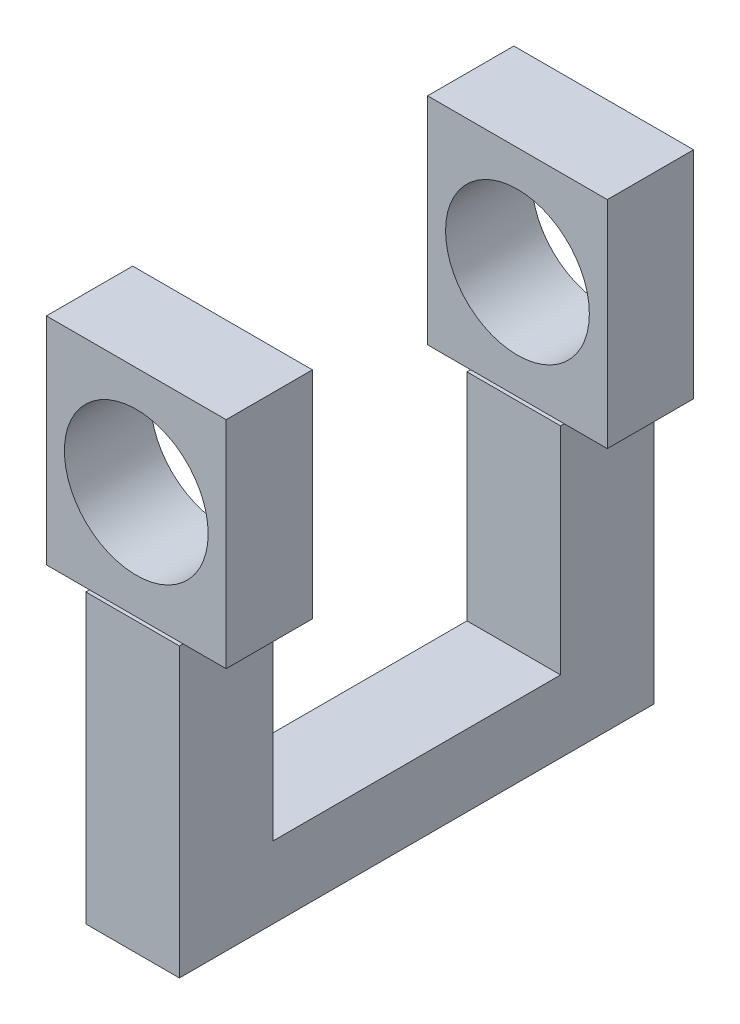
ISO-10303-21;
HEADER;
FILE_DESCRIPTION(('STEP AP214'),'2;1');
FILE_NAME('part.step','',(''),(''),'','','');
FILE_SCHEMA(('AUTOMOTIVE_DESIGN { 1 0 10303 214 1 1 1 1 }'));
ENDSEC;
DATA;
#1=APPLICATION_CONTEXT('core data for automotive mechanical design processes');
#2=APPLICATION_PROTOCOL_DEFINITION('international standard','automotive_design',2000,#1);
#3=PRODUCT_CONTEXT('',#1,'mechanical');
#4=PRODUCT('Part','Part','',(#3));
#5=PRODUCT_RELATED_PRODUCT_CATEGORY('part','',(#4));
#6=PRODUCT_DEFINITION_FORMATION('','',#4);
#7=PRODUCT_DEFINITION_CONTEXT('part definition',#1,'design');
#8=PRODUCT_DEFINITION('design','',#6,#7);
#9=PRODUCT_DEFINITION_SHAPE('','',#8);
#10=(LENGTH_UNIT() NAMED_UNIT(*) SI_UNIT(.MILLI.,.METRE.));
#11=(NAMED_UNIT(*) PLANE_ANGLE_UNIT() SI_UNIT($,.RADIAN.));
#12=(NAMED_UNIT(*) SI_UNIT($,.STERADIAN.) SOLID_ANGLE_UNIT());
#13=UNCERTAINTY_MEASURE_WITH_UNIT(LENGTH_MEASURE(1.E-05),#10,'distance_accuracy_value','');
#14=(GEOMETRIC_REPRESENTATION_CONTEXT(3) GLOBAL_UNCERTAINTY_ASSIGNED_CONTEXT((#13)) GLOBAL_UNIT_ASSIGNED_CONTEXT((#10,
#11,#12)) REPRESENTATION_CONTEXT('',''));
#15=CARTESIAN_POINT('',(0.,0.,0.));
#16=DIRECTION('',(0.,0.,1.));
#17=DIRECTION('',(1.,0.,0.));
#18=AXIS2_PLACEMENT_3D('',#15,#16,#17);
#19=CARTESIAN_POINT('',(0.,40.,0.));
#20=DIRECTION('',(0.,1.,0.));
#21=DIRECTION('',(0.,0.,1.));
#22=AXIS2_PLACEMENT_3D('',#19,#20,#21);
#23=PLANE('',#22);
#24=DIRECTION('',(0.,0.,1.));
#25=VECTOR('',#24,1.);
#26=CARTESIAN_POINT('',(0.,40.,0.));
#27=LINE('',#26,#25);
#28=CARTESIAN_POINT('',(0.,40.,0.));
#29=VERTEX_POINT('',#28);
#30=CARTESIAN_POINT('',(0.,40.,0.511000000000001));
#31=VERTEX_POINT('',#30);
#32=EDGE_CURVE('E347',#29,#31,#27,.T.);
#33=ORIENTED_EDGE('',*,*,#32,.T.);
#34=DIRECTION('',(1.,0.,0.));
#35=VECTOR('',#34,1.);
#36=CARTESIAN_POINT('',(0.,40.,0.511000000000001));
#37=LINE('',#36,#35);
#38=CARTESIAN_POINT('',(13.022,40.,0.511000000000001));
#39=VERTEX_POINT('',#38);
#40=EDGE_CURVE('E11',#31,#39,#37,.T.);
#41=ORIENTED_EDGE('',*,*,#40,.T.);
#42=DIRECTION('',(0.,0.,-1.));
#43=VECTOR('',#42,1.);
#44=CARTESIAN_POINT('',(13.022,40.,0.));
#45=LINE('',#44,#43);
#46=CARTESIAN_POINT('',(13.022,40.,0.));
#47=VERTEX_POINT('',#46);
#48=EDGE_CURVE('E354',#39,#47,#45,.T.);
#49=ORIENTED_EDGE('',*,*,#48,.T.);
#50=DIRECTION('',(-1.,0.,0.));
#51=VECTOR('',#50,1.);
#52=CARTESIAN_POINT('',(0.,40.,0.));
#53=LINE('',#52,#51);
#54=EDGE_CURVE('E358',#47,#29,#53,.T.);
#55=ORIENTED_EDGE('',*,*,#54,.T.);
#56=EDGE_LOOP('',(#33,#41,#49,#55));
#57=FACE_BOUND('',#56,.T.);
#58=ADVANCED_FACE('F36',(#57),#23,.T.);
#59=CARTESIAN_POINT('',(13.022,40.,13.022));
#60=VERTEX_POINT('',#59);
#61=CARTESIAN_POINT('',(13.022,40.,12.511));
#62=VERTEX_POINT('',#61);
#63=EDGE_CURVE('E355',#60,#62,#45,.T.);
#64=ORIENTED_EDGE('',*,*,#63,.T.);
#65=DIRECTION('',(-1.,0.,0.));
#66=VECTOR('',#65,1.);
#67=CARTESIAN_POINT('',(0.,40.,12.511));
#68=LINE('',#67,#66);
#69=CARTESIAN_POINT('',(0.,40.,12.511));
#70=VERTEX_POINT('',#69);
#71=EDGE_CURVE('E44',#62,#70,#68,.T.);
#72=ORIENTED_EDGE('',*,*,#71,.T.);
#73=CARTESIAN_POINT('',(0.,40.,13.022));
#74=VERTEX_POINT('',#73);
#75=EDGE_CURVE('E346',#70,#74,#27,.T.);
#76=ORIENTED_EDGE('',*,*,#75,.T.);
#77=DIRECTION('',(1.,0.,0.));
#78=VECTOR('',#77,1.);
#79=CARTESIAN_POINT('',(0.,40.,13.022));
#80=LINE('',#79,#78);
#81=EDGE_CURVE('E350',#74,#60,#80,.T.);
#82=ORIENTED_EDGE('',*,*,#81,.T.);
#83=EDGE_LOOP('',(#64,#72,#76,#82));
#84=FACE_BOUND('',#83,.T.);
#85=ADVANCED_FACE('F424',(#84),#23,.T.);
#86=CARTESIAN_POINT('',(0.,40.,0.));
#87=DIRECTION('',(0.,-1.,0.));
#88=DIRECTION('',(0.,0.,-1.));
#89=AXIS2_PLACEMENT_3D('',#86,#87,#88);
#90=PLANE('',#89);
#91=DIRECTION('',(-1.,0.,0.));
#92=VECTOR('',#91,1.);
#93=CARTESIAN_POINT('',(0.,40.,-52.511));
#94=LINE('',#93,#92);
#95=CARTESIAN_POINT('',(13.022,40.,-52.511));
#96=VERTEX_POINT('',#95);
#97=CARTESIAN_POINT('',(0.,40.,-52.511));
#98=VERTEX_POINT('',#97);
#99=EDGE_CURVE('E59',#96,#98,#94,.T.);
#100=ORIENTED_EDGE('',*,*,#99,.F.);
#101=DIRECTION('',(0.,0.,-1.));
#102=VECTOR('',#101,1.);
#103=CARTESIAN_POINT('',(13.022,40.,-40.));
#104=LINE('',#103,#102);
#105=CARTESIAN_POINT('',(13.022,40.,-53.022));
#106=VERTEX_POINT('',#105);
#107=EDGE_CURVE('E382',#96,#106,#104,.T.);
#108=ORIENTED_EDGE('',*,*,#107,.T.);
#109=DIRECTION('',(-1.,0.,0.));
#110=VECTOR('',#109,1.);
#111=CARTESIAN_POINT('',(0.,40.,-53.022));
#112=LINE('',#111,#110);
#113=CARTESIAN_POINT('',(0.,40.,-53.022));
#114=VERTEX_POINT('',#113);
#115=EDGE_CURVE('E385',#106,#114,#112,.T.);
#116=ORIENTED_EDGE('',*,*,#115,.T.);
#117=DIRECTION('',(0.,0.,1.));
#118=VECTOR('',#117,1.);
#119=CARTESIAN_POINT('',(0.,40.,-40.));
#120=LINE('',#119,#118);
#121=EDGE_CURVE('E376',#114,#98,#120,.T.);
#122=ORIENTED_EDGE('',*,*,#121,.T.);
#123=EDGE_LOOP('',(#100,#108,#116,#122));
#124=FACE_BOUND('',#123,.T.);
#125=ADVANCED_FACE('F493',(#124),#90,.F.);
#126=DIRECTION('',(1.,0.,0.));
#127=VECTOR('',#126,1.);
#128=CARTESIAN_POINT('',(0.,40.,-40.511));
#129=LINE('',#128,#127);
#130=CARTESIAN_POINT('',(0.,40.,-40.511));
#131=VERTEX_POINT('',#130);
#132=CARTESIAN_POINT('',(13.022,40.,-40.511));
#133=VERTEX_POINT('',#132);
#134=EDGE_CURVE('E416',#131,#133,#129,.T.);
#135=ORIENTED_EDGE('',*,*,#134,.F.);
#136=CARTESIAN_POINT('',(0.,40.,-40.));
#137=VERTEX_POINT('',#136);
#138=EDGE_CURVE('E368',#131,#137,#120,.T.);
#139=ORIENTED_EDGE('',*,*,#138,.T.);
#140=DIRECTION('',(1.,0.,0.));
#141=VECTOR('',#140,1.);
#142=CARTESIAN_POINT('',(0.,40.,-40.));
#143=LINE('',#142,#141);
#144=CARTESIAN_POINT('',(13.022,40.,-40.));
#145=VERTEX_POINT('',#144);
#146=EDGE_CURVE('E378',#137,#145,#143,.T.);
#147=ORIENTED_EDGE('',*,*,#146,.T.);
#148=EDGE_CURVE('E383',#145,#133,#104,.T.);
#149=ORIENTED_EDGE('',*,*,#148,.T.);
#150=EDGE_LOOP('',(#135,#139,#147,#149));
#151=FACE_BOUND('',#150,.T.);
#152=ADVANCED_FACE('F510',(#151),#90,.F.);
#153=CARTESIAN_POINT('',(1.06,-10.,1.06));
#154=DIRECTION('',(-1.,0.,0.));
#155=DIRECTION('',(0.,0.,1.));
#156=AXIS2_PLACEMENT_3D('',#153,#154,#155);
#157=PLANE('',#156);
#158=DIRECTION('',(0.,0.,1.));
#159=VECTOR('',#158,1.);
#160=CARTESIAN_POINT('',(1.06,25.,1.06));
#161=LINE('',#160,#159);
#162=CARTESIAN_POINT('',(1.06,25.,1.06));
#163=VERTEX_POINT('',#162);
#164=CARTESIAN_POINT('',(1.06,25.,11.962));
#165=VERTEX_POINT('',#164);
#166=EDGE_CURVE('E288',#163,#165,#161,.T.);
#167=ORIENTED_EDGE('',*,*,#166,.T.);
#168=DIRECTION('',(0.,1.,0.));
#169=VECTOR('',#168,1.);
#170=CARTESIAN_POINT('',(1.06,-10.,11.962));
#171=LINE('',#170,#169);
#172=CARTESIAN_POINT('',(1.06,0.,11.962));
#173=VERTEX_POINT('',#172);
#174=EDGE_CURVE('E306',#173,#165,#171,.T.);
#175=ORIENTED_EDGE('',*,*,#174,.F.);
#176=DIRECTION('',(0.,0.,-1.));
#177=VECTOR('',#176,1.);
#178=CARTESIAN_POINT('',(1.06,0.,0.));
#179=LINE('',#178,#177);
#180=CARTESIAN_POINT('',(1.06,0.,1.06));
#181=VERTEX_POINT('',#180);
#182=EDGE_CURVE('E335',#173,#181,#179,.T.);
#183=ORIENTED_EDGE('',*,*,#182,.T.);
#184=DIRECTION('',(0.,1.,0.));
#185=VECTOR('',#184,1.);
#186=CARTESIAN_POINT('',(1.06,-10.,1.06));
#187=LINE('',#186,#185);
#188=EDGE_CURVE('E319',#181,#163,#187,.T.);
#189=ORIENTED_EDGE('',*,*,#188,.T.);
#190=EDGE_LOOP('',(#167,#175,#183,#189));
#191=FACE_BOUND('',#190,.T.);
#192=ADVANCED_FACE('F496',(#191),#157,.F.);
#193=CARTESIAN_POINT('',(1.06,-10.,1.06));
#194=DIRECTION('',(0.,0.,-1.));
#195=DIRECTION('',(-1.,0.,0.));
#196=AXIS2_PLACEMENT_3D('',#193,#194,#195);
#197=PLANE('',#196);
#198=DIRECTION('',(-1.,0.,0.));
#199=VECTOR('',#198,1.);
#200=CARTESIAN_POINT('',(1.06,25.,1.06));
#201=LINE('',#200,#199);
#202=CARTESIAN_POINT('',(11.962,25.,1.06));
#203=VERTEX_POINT('',#202);
#204=EDGE_CURVE('E295',#203,#163,#201,.T.);
#205=ORIENTED_EDGE('',*,*,#204,.T.);
#206=ORIENTED_EDGE('',*,*,#188,.F.);
#207=DIRECTION('',(1.,0.,0.));
#208=VECTOR('',#207,1.);
#209=CARTESIAN_POINT('',(0.,0.,1.06));
#210=LINE('',#209,#208);
#211=CARTESIAN_POINT('',(11.962,0.,1.06));
#212=VERTEX_POINT('',#211);
#213=EDGE_CURVE('E333',#181,#212,#210,.T.);
#214=ORIENTED_EDGE('',*,*,#213,.T.);
#215=DIRECTION('',(0.,1.,0.));
#216=VECTOR('',#215,1.);
#217=CARTESIAN_POINT('',(11.962,-10.,1.06));
#218=LINE('',#217,#216);
#219=EDGE_CURVE('E322',#212,#203,#218,.T.);
#220=ORIENTED_EDGE('',*,*,#219,.T.);
#221=EDGE_LOOP('',(#205,#206,#214,#220));
#222=FACE_BOUND('',#221,.T.);
#223=ADVANCED_FACE('F549',(#222),#197,.F.);
#224=CARTESIAN_POINT('',(11.962,-10.,1.06));
#225=DIRECTION('',(1.,0.,0.));
#226=DIRECTION('',(0.,0.,-1.));
#227=AXIS2_PLACEMENT_3D('',#224,#225,#226);
#228=PLANE('',#227);
#229=DIRECTION('',(0.,0.,-1.));
#230=VECTOR('',#229,1.);
#231=CARTESIAN_POINT('',(11.962,25.,1.06));
#232=LINE('',#231,#230);
#233=CARTESIAN_POINT('',(11.962,25.,11.962));
#234=VERTEX_POINT('',#233);
#235=EDGE_CURVE('E293',#234,#203,#232,.T.);
#236=ORIENTED_EDGE('',*,*,#235,.T.);
#237=ORIENTED_EDGE('',*,*,#219,.F.);
#238=DIRECTION('',(0.,0.,1.));
#239=VECTOR('',#238,1.);
#240=CARTESIAN_POINT('',(11.962,0.,0.));
#241=LINE('',#240,#239);
#242=CARTESIAN_POINT('',(11.962,0.,11.962));
#243=VERTEX_POINT('',#242);
#244=EDGE_CURVE('E330',#212,#243,#241,.T.);
#245=ORIENTED_EDGE('',*,*,#244,.T.);
#246=DIRECTION('',(0.,1.,0.));
#247=VECTOR('',#246,1.);
#248=CARTESIAN_POINT('',(11.962,-10.,11.962));
#249=LINE('',#248,#247);
#250=EDGE_CURVE('E325',#243,#234,#249,.T.);
#251=ORIENTED_EDGE('',*,*,#250,.T.);
#252=EDGE_LOOP('',(#236,#237,#245,#251));
#253=FACE_BOUND('',#252,.T.);
#254=ADVANCED_FACE('F552',(#253),#228,.F.);
#255=CARTESIAN_POINT('',(1.06,-10.,11.962));
#256=DIRECTION('',(0.,0.,1.));
#257=DIRECTION('',(1.,0.,0.));
#258=AXIS2_PLACEMENT_3D('',#255,#256,#257);
#259=PLANE('',#258);
#260=DIRECTION('',(1.,0.,0.));
#261=VECTOR('',#260,1.);
#262=CARTESIAN_POINT('',(1.06,25.,11.962));
#263=LINE('',#262,#261);
#264=EDGE_CURVE('E291',#165,#234,#263,.T.);
#265=ORIENTED_EDGE('',*,*,#264,.T.);
#266=ORIENTED_EDGE('',*,*,#250,.F.);
#267=DIRECTION('',(-1.,0.,0.));
#268=VECTOR('',#267,1.);
#269=CARTESIAN_POINT('',(0.,0.,11.962));
#270=LINE('',#269,#268);
#271=EDGE_CURVE('E310',#243,#173,#270,.T.);
#272=ORIENTED_EDGE('',*,*,#271,.T.);
#273=ORIENTED_EDGE('',*,*,#174,.T.);
#274=EDGE_LOOP('',(#265,#266,#272,#273));
#275=FACE_BOUND('',#274,.T.);
#276=ADVANCED_FACE('F547',(#275),#259,.F.);
#277=CARTESIAN_POINT('',(1.06,-10.,-51.962));
#278=DIRECTION('',(-1.,0.,0.));
#279=DIRECTION('',(0.,0.,1.));
#280=AXIS2_PLACEMENT_3D('',#277,#278,#279);
#281=PLANE('',#280);
#282=DIRECTION('',(0.,0.,1.));
#283=VECTOR('',#282,1.);
#284=CARTESIAN_POINT('',(1.06,25.,-51.962));
#285=LINE('',#284,#283);
#286=CARTESIAN_POINT('',(1.06,25.,-51.962));
#287=VERTEX_POINT('',#286);
#288=CARTESIAN_POINT('',(1.06,25.,-41.06));
#289=VERTEX_POINT('',#288);
#290=EDGE_CURVE('E297',#287,#289,#285,.T.);
#291=ORIENTED_EDGE('',*,*,#290,.T.);
#292=DIRECTION('',(0.,1.,0.));
#293=VECTOR('',#292,1.);
#294=CARTESIAN_POINT('',(1.06,-10.,-41.06));
#295=LINE('',#294,#293);
#296=CARTESIAN_POINT('',(1.06,0.,-41.06));
#297=VERTEX_POINT('',#296);
#298=EDGE_CURVE('E317',#297,#289,#295,.T.);
#299=ORIENTED_EDGE('',*,*,#298,.F.);
#300=DIRECTION('',(0.,0.,-1.));
#301=VECTOR('',#300,1.);
#302=CARTESIAN_POINT('',(1.06000000000001,0.,0.));
#303=LINE('',#302,#301);
#304=CARTESIAN_POINT('',(1.06,0.,-51.962));
#305=VERTEX_POINT('',#304);
#306=EDGE_CURVE('E344',#297,#305,#303,.T.);
#307=ORIENTED_EDGE('',*,*,#306,.T.);
#308=DIRECTION('',(0.,1.,0.));
#309=VECTOR('',#308,1.);
#310=CARTESIAN_POINT('',(1.06,-10.,-51.962));
#311=LINE('',#310,#309);
#312=EDGE_CURVE('E307',#305,#287,#311,.T.);
#313=ORIENTED_EDGE('',*,*,#312,.T.);
#314=EDGE_LOOP('',(#291,#299,#307,#313));
#315=FACE_BOUND('',#314,.T.);
#316=ADVANCED_FACE('F544',(#315),#281,.F.);
#317=CARTESIAN_POINT('',(1.06,-10.,-51.962));
#318=DIRECTION('',(0.,0.,-1.));
#319=DIRECTION('',(-1.,0.,0.));
#320=AXIS2_PLACEMENT_3D('',#317,#318,#319);
#321=PLANE('',#320);
#322=DIRECTION('',(-1.,0.,0.));
#323=VECTOR('',#322,1.);
#324=CARTESIAN_POINT('',(1.06,25.,-51.962));
#325=LINE('',#324,#323);
#326=CARTESIAN_POINT('',(11.962,25.,-51.962));
#327=VERTEX_POINT('',#326);
#328=EDGE_CURVE('E304',#327,#287,#325,.T.);
#329=ORIENTED_EDGE('',*,*,#328,.T.);
#330=ORIENTED_EDGE('',*,*,#312,.F.);
#331=DIRECTION('',(1.,0.,0.));
#332=VECTOR('',#331,1.);
#333=CARTESIAN_POINT('',(0.,0.,-51.962));
#334=LINE('',#333,#332);
#335=CARTESIAN_POINT('',(11.962,0.,-51.962));
#336=VERTEX_POINT('',#335);
#337=EDGE_CURVE('E342',#305,#336,#334,.T.);
#338=ORIENTED_EDGE('',*,*,#337,.T.);
#339=DIRECTION('',(0.,1.,0.));
#340=VECTOR('',#339,1.);
#341=CARTESIAN_POINT('',(11.962,-10.,-51.962));
#342=LINE('',#341,#340);
#343=EDGE_CURVE('E311',#336,#327,#342,.T.);
#344=ORIENTED_EDGE('',*,*,#343,.T.);
#345=EDGE_LOOP('',(#329,#330,#338,#344));
#346=FACE_BOUND('',#345,.T.);
#347=ADVANCED_FACE('F539',(#346),#321,.F.);
#348=CARTESIAN_POINT('',(11.962,-10.,-51.962));
#349=DIRECTION('',(1.,0.,0.));
#350=DIRECTION('',(0.,0.,-1.));
#351=AXIS2_PLACEMENT_3D('',#348,#349,#350);
#352=PLANE('',#351);
#353=DIRECTION('',(0.,0.,-1.));
#354=VECTOR('',#353,1.);
#355=CARTESIAN_POINT('',(11.962,25.,-51.962));
#356=LINE('',#355,#354);
#357=CARTESIAN_POINT('',(11.962,25.,-41.06));
#358=VERTEX_POINT('',#357);
#359=EDGE_CURVE('E302',#358,#327,#356,.T.);
#360=ORIENTED_EDGE('',*,*,#359,.T.);
#361=ORIENTED_EDGE('',*,*,#343,.F.);
#362=DIRECTION('',(0.,0.,1.));
#363=VECTOR('',#362,1.);
#364=CARTESIAN_POINT('',(11.962,0.,0.));
#365=LINE('',#364,#363);
#366=CARTESIAN_POINT('',(11.962,0.,-41.06));
#367=VERTEX_POINT('',#366);
#368=EDGE_CURVE('E339',#336,#367,#365,.T.);
#369=ORIENTED_EDGE('',*,*,#368,.T.);
#370=DIRECTION('',(0.,1.,0.));
#371=VECTOR('',#370,1.);
#372=CARTESIAN_POINT('',(11.962,-10.,-41.06));
#373=LINE('',#372,#371);
#374=EDGE_CURVE('E314',#367,#358,#373,.T.);
#375=ORIENTED_EDGE('',*,*,#374,.T.);
#376=EDGE_LOOP('',(#360,#361,#369,#375));
#377=FACE_BOUND('',#376,.T.);
#378=ADVANCED_FACE('F533',(#377),#352,.F.);
#379=CARTESIAN_POINT('',(1.06,-10.,-41.06));
#380=DIRECTION('',(0.,0.,1.));
#381=DIRECTION('',(1.,0.,0.));
#382=AXIS2_PLACEMENT_3D('',#379,#380,#381);
#383=PLANE('',#382);
#384=DIRECTION('',(1.,0.,0.));
#385=VECTOR('',#384,1.);
#386=CARTESIAN_POINT('',(1.06,25.,-41.06));
#387=LINE('',#386,#385);
#388=EDGE_CURVE('E300',#289,#358,#387,.T.);
#389=ORIENTED_EDGE('',*,*,#388,.T.);
#390=ORIENTED_EDGE('',*,*,#374,.F.);
#391=DIRECTION('',(-1.,0.,0.));
#392=VECTOR('',#391,1.);
#393=CARTESIAN_POINT('',(0.,0.,-41.06));
#394=LINE('',#393,#392);
#395=EDGE_CURVE('E337',#367,#297,#394,.T.);
#396=ORIENTED_EDGE('',*,*,#395,.T.);
#397=ORIENTED_EDGE('',*,*,#298,.T.);
#398=EDGE_LOOP('',(#389,#390,#396,#397));
#399=FACE_BOUND('',#398,.T.);
#400=ADVANCED_FACE('F529',(#399),#383,.F.);
#401=CARTESIAN_POINT('',(0.,10.,0.));
#402=DIRECTION('',(1.,0.,0.));
#403=DIRECTION('',(0.,0.,-1.));
#404=AXIS2_PLACEMENT_3D('',#401,#402,#403);
#405=PLANE('',#404);
#406=DIRECTION('',(0.,0.,1.));
#407=VECTOR('',#406,1.);
#408=CARTESIAN_POINT('',(0.,0.,0.));
#409=LINE('',#408,#407);
#410=CARTESIAN_POINT('',(0.,0.,-53.022));
#411=VERTEX_POINT('',#410);
#412=CARTESIAN_POINT('',(0.,0.,13.022));
#413=VERTEX_POINT('',#412);
#414=EDGE_CURVE('E395',#411,#413,#409,.T.);
#415=ORIENTED_EDGE('',*,*,#414,.T.);
#416=DIRECTION('',(0.,1.,0.));
#417=VECTOR('',#416,1.);
#418=CARTESIAN_POINT('',(0.,0.,13.022));
#419=LINE('',#418,#417);
#420=EDGE_CURVE('E365',#413,#74,#419,.T.);
#421=ORIENTED_EDGE('',*,*,#420,.T.);
#422=ORIENTED_EDGE('',*,*,#75,.F.);
#423=EDGE_CURVE('E351',#31,#70,#27,.T.);
#424=ORIENTED_EDGE('',*,*,#423,.F.);
#425=ORIENTED_EDGE('',*,*,#32,.F.);
#426=DIRECTION('',(0.,1.,0.));
#427=VECTOR('',#426,1.);
#428=CARTESIAN_POINT('',(0.,0.,0.));
#429=LINE('',#428,#427);
#430=CARTESIAN_POINT('',(0.,10.,0.));
#431=VERTEX_POINT('',#430);
#432=EDGE_CURVE('E366',#431,#29,#429,.T.);
#433=ORIENTED_EDGE('',*,*,#432,.F.);
#434=DIRECTION('',(0.,0.,1.));
#435=VECTOR('',#434,1.);
#436=CARTESIAN_POINT('',(0.,10.,0.));
#437=LINE('',#436,#435);
#438=CARTESIAN_POINT('',(0.,10.,-40.));
#439=VERTEX_POINT('',#438);
#440=EDGE_CURVE('E403',#439,#431,#437,.T.);
#441=ORIENTED_EDGE('',*,*,#440,.F.);
#442=DIRECTION('',(0.,1.,0.));
#443=VECTOR('',#442,1.);
#444=CARTESIAN_POINT('',(0.,0.,-40.));
#445=LINE('',#444,#443);
#446=EDGE_CURVE('E392',#439,#137,#445,.T.);
#447=ORIENTED_EDGE('',*,*,#446,.T.);
#448=ORIENTED_EDGE('',*,*,#138,.F.);
#449=EDGE_CURVE('E379',#98,#131,#120,.T.);
#450=ORIENTED_EDGE('',*,*,#449,.F.);
#451=ORIENTED_EDGE('',*,*,#121,.F.);
#452=DIRECTION('',(0.,1.,0.));
#453=VECTOR('',#452,1.);
#454=CARTESIAN_POINT('',(0.,0.,-53.022));
#455=LINE('',#454,#453);
#456=EDGE_CURVE('E393',#411,#114,#455,.T.);
#457=ORIENTED_EDGE('',*,*,#456,.F.);
#458=EDGE_LOOP('',(#415,#421,#422,#424,#425,#433,#441,#447,#448,#450,#451,#457));
#459=FACE_BOUND('',#458,.T.);
#460=ADVANCED_FACE('F38',(#459),#405,.F.);
#461=CARTESIAN_POINT('',(13.022,10.,0.));
#462=DIRECTION('',(-1.,0.,0.));
#463=DIRECTION('',(0.,0.,1.));
#464=AXIS2_PLACEMENT_3D('',#461,#462,#463);
#465=PLANE('',#464);
#466=DIRECTION('',(0.,0.,-1.));
#467=VECTOR('',#466,1.);
#468=CARTESIAN_POINT('',(13.022,0.,0.));
#469=LINE('',#468,#467);
#470=CARTESIAN_POINT('',(13.022,0.,13.022));
#471=VERTEX_POINT('',#470);
#472=CARTESIAN_POINT('',(13.022,0.,-53.022));
#473=VERTEX_POINT('',#472);
#474=EDGE_CURVE('E407',#471,#473,#469,.T.);
#475=ORIENTED_EDGE('',*,*,#474,.T.);
#476=DIRECTION('',(0.,1.,0.));
#477=VECTOR('',#476,1.);
#478=CARTESIAN_POINT('',(13.022,0.,-53.022));
#479=LINE('',#478,#477);
#480=EDGE_CURVE('E396',#473,#106,#479,.T.);
#481=ORIENTED_EDGE('',*,*,#480,.T.);
#482=ORIENTED_EDGE('',*,*,#107,.F.);
#483=EDGE_CURVE('E386',#133,#96,#104,.T.);
#484=ORIENTED_EDGE('',*,*,#483,.F.);
#485=ORIENTED_EDGE('',*,*,#148,.F.);
#486=DIRECTION('',(0.,1.,0.));
#487=VECTOR('',#486,1.);
#488=CARTESIAN_POINT('',(13.022,0.,-40.));
#489=LINE('',#488,#487);
#490=CARTESIAN_POINT('',(13.022,10.,-40.));
#491=VERTEX_POINT('',#490);
#492=EDGE_CURVE('E399',#491,#145,#489,.T.);
#493=ORIENTED_EDGE('',*,*,#492,.F.);
#494=DIRECTION('',(0.,0.,-1.));
#495=VECTOR('',#494,1.);
#496=CARTESIAN_POINT('',(13.022,10.,0.));
#497=LINE('',#496,#495);
#498=CARTESIAN_POINT('',(13.022,10.,0.));
#499=VERTEX_POINT('',#498);
#500=EDGE_CURVE('E410',#499,#491,#497,.T.);
#501=ORIENTED_EDGE('',*,*,#500,.F.);
#502=DIRECTION('',(0.,1.,0.));
#503=VECTOR('',#502,1.);
#504=CARTESIAN_POINT('',(13.022,0.,0.));
#505=LINE('',#504,#503);
#506=EDGE_CURVE('E369',#499,#47,#505,.T.);
#507=ORIENTED_EDGE('',*,*,#506,.T.);
#508=ORIENTED_EDGE('',*,*,#48,.F.);
#509=EDGE_CURVE('E359',#62,#39,#45,.T.);
#510=ORIENTED_EDGE('',*,*,#509,.F.);
#511=ORIENTED_EDGE('',*,*,#63,.F.);
#512=DIRECTION('',(0.,1.,0.));
#513=VECTOR('',#512,1.);
#514=CARTESIAN_POINT('',(13.022,0.,13.022));
#515=LINE('',#514,#513);
#516=EDGE_CURVE('E372',#471,#60,#515,.T.);
#517=ORIENTED_EDGE('',*,*,#516,.F.);
#518=EDGE_LOOP('',(#475,#481,#482,#484,#485,#493,#501,#507,#508,#510,#511,#517));
#519=FACE_BOUND('',#518,.T.);
#520=ADVANCED_FACE('F443',(#519),#465,.F.);
#521=CARTESIAN_POINT('',(0.,10.,0.));
#522=DIRECTION('',(0.,-1.,0.));
#523=DIRECTION('',(0.,0.,-1.));
#524=AXIS2_PLACEMENT_3D('',#521,#522,#523);
#525=PLANE('',#524);
#526=ORIENTED_EDGE('',*,*,#440,.T.);
#527=DIRECTION('',(1.,0.,0.));
#528=VECTOR('',#527,1.);
#529=CARTESIAN_POINT('',(0.,10.,0.));
#530=LINE('',#529,#528);
#531=EDGE_CURVE('E406',#431,#499,#530,.T.);
#532=ORIENTED_EDGE('',*,*,#531,.T.);
#533=ORIENTED_EDGE('',*,*,#500,.T.);
#534=DIRECTION('',(-1.,0.,0.));
#535=VECTOR('',#534,1.);
#536=CARTESIAN_POINT('',(0.,10.,-40.));
#537=LINE('',#536,#535);
#538=EDGE_CURVE('E413',#491,#439,#537,.T.);
#539=ORIENTED_EDGE('',*,*,#538,.T.);
#540=EDGE_LOOP('',(#526,#532,#533,#539));
#541=FACE_BOUND('',#540,.T.);
#542=ADVANCED_FACE('F519',(#541),#525,.F.);
#543=CARTESIAN_POINT('',(0.,0.,0.));
#544=DIRECTION('',(0.,-1.,0.));
#545=DIRECTION('',(0.,0.,-1.));
#546=AXIS2_PLACEMENT_3D('',#543,#544,#545);
#547=PLANE('',#546);
#548=ORIENTED_EDGE('',*,*,#306,.F.);
#549=ORIENTED_EDGE('',*,*,#395,.F.);
#550=ORIENTED_EDGE('',*,*,#368,.F.);
#551=ORIENTED_EDGE('',*,*,#337,.F.);
#552=EDGE_LOOP('',(#548,#549,#550,#551));
#553=FACE_BOUND('',#552,.T.);
#554=ORIENTED_EDGE('',*,*,#182,.F.);
#555=ORIENTED_EDGE('',*,*,#271,.F.);
#556=ORIENTED_EDGE('',*,*,#244,.F.);
#557=ORIENTED_EDGE('',*,*,#213,.F.);
#558=EDGE_LOOP('',(#554,#555,#556,#557));
#559=FACE_BOUND('',#558,.T.);
#560=ORIENTED_EDGE('',*,*,#414,.F.);
#561=DIRECTION('',(-1.,0.,0.));
#562=VECTOR('',#561,1.);
#563=CARTESIAN_POINT('',(0.,0.,-53.022));
#564=LINE('',#563,#562);
#565=EDGE_CURVE('E389',#473,#411,#564,.T.);
#566=ORIENTED_EDGE('',*,*,#565,.F.);
#567=ORIENTED_EDGE('',*,*,#474,.F.);
#568=DIRECTION('',(1.,0.,0.));
#569=VECTOR('',#568,1.);
#570=CARTESIAN_POINT('',(0.,0.,13.022));
#571=LINE('',#570,#569);
#572=EDGE_CURVE('E362',#413,#471,#571,.T.);
#573=ORIENTED_EDGE('',*,*,#572,.F.);
#574=EDGE_LOOP('',(#560,#566,#567,#573));
#575=FACE_BOUND('',#574,.T.);
#576=ADVANCED_FACE('F517',(#553,#559,#575),#547,.T.);
#577=CARTESIAN_POINT('',(0.,0.,-40.));
#578=DIRECTION('',(0.,0.,1.));
#579=DIRECTION('',(1.,0.,0.));
#580=AXIS2_PLACEMENT_3D('',#577,#578,#579);
#581=PLANE('',#580);
#582=ORIENTED_EDGE('',*,*,#538,.F.);
#583=ORIENTED_EDGE('',*,*,#492,.T.);
#584=ORIENTED_EDGE('',*,*,#146,.F.);
#585=ORIENTED_EDGE('',*,*,#446,.F.);
#586=EDGE_LOOP('',(#582,#583,#584,#585));
#587=FACE_BOUND('',#586,.T.);
#588=ADVANCED_FACE('F513',(#587),#581,.T.);
#589=CARTESIAN_POINT('',(0.,0.,-53.022));
#590=DIRECTION('',(0.,0.,-1.));
#591=DIRECTION('',(-1.,0.,0.));
#592=AXIS2_PLACEMENT_3D('',#589,#590,#591);
#593=PLANE('',#592);
#594=ORIENTED_EDGE('',*,*,#456,.T.);
#595=ORIENTED_EDGE('',*,*,#115,.F.);
#596=ORIENTED_EDGE('',*,*,#480,.F.);
#597=ORIENTED_EDGE('',*,*,#565,.T.);
#598=EDGE_LOOP('',(#594,#595,#596,#597));
#599=FACE_BOUND('',#598,.T.);
#600=ADVANCED_FACE('F502',(#599),#593,.T.);
#601=CARTESIAN_POINT('',(0.,0.,0.));
#602=DIRECTION('',(0.,0.,-1.));
#603=DIRECTION('',(-1.,0.,0.));
#604=AXIS2_PLACEMENT_3D('',#601,#602,#603);
#605=PLANE('',#604);
#606=ORIENTED_EDGE('',*,*,#531,.F.);
#607=ORIENTED_EDGE('',*,*,#432,.T.);
#608=ORIENTED_EDGE('',*,*,#54,.F.);
#609=ORIENTED_EDGE('',*,*,#506,.F.);
#610=EDGE_LOOP('',(#606,#607,#608,#609));
#611=FACE_BOUND('',#610,.T.);
#612=ADVANCED_FACE('F498',(#611),#605,.T.);
#613=CARTESIAN_POINT('',(0.,0.,13.022));
#614=DIRECTION('',(0.,0.,1.));
#615=DIRECTION('',(1.,0.,0.));
#616=AXIS2_PLACEMENT_3D('',#613,#614,#615);
#617=PLANE('',#616);
#618=ORIENTED_EDGE('',*,*,#516,.T.);
#619=ORIENTED_EDGE('',*,*,#81,.F.);
#620=ORIENTED_EDGE('',*,*,#420,.F.);
#621=ORIENTED_EDGE('',*,*,#572,.T.);
#622=EDGE_LOOP('',(#618,#619,#620,#621));
#623=FACE_BOUND('',#622,.T.);
#624=ADVANCED_FACE('F501',(#623),#617,.T.);
#625=CARTESIAN_POINT('',(0.,25.,0.));
#626=DIRECTION('',(0.,1.,0.));
#627=DIRECTION('',(0.,0.,1.));
#628=AXIS2_PLACEMENT_3D('',#625,#626,#627);
#629=PLANE('',#628);
#630=ORIENTED_EDGE('',*,*,#290,.F.);
#631=ORIENTED_EDGE('',*,*,#328,.F.);
#632=ORIENTED_EDGE('',*,*,#359,.F.);
#633=ORIENTED_EDGE('',*,*,#388,.F.);
#634=EDGE_LOOP('',(#630,#631,#632,#633));
#635=FACE_BOUND('',#634,.T.);
#636=ADVANCED_FACE('F506',(#635),#629,.F.);
#637=CARTESIAN_POINT('',(0.,25.,0.));
#638=DIRECTION('',(0.,1.,0.));
#639=DIRECTION('',(0.,0.,1.));
#640=AXIS2_PLACEMENT_3D('',#637,#638,#639);
#641=PLANE('',#640);
#642=ORIENTED_EDGE('',*,*,#166,.F.);
#643=ORIENTED_EDGE('',*,*,#204,.F.);
#644=ORIENTED_EDGE('',*,*,#235,.F.);
#645=ORIENTED_EDGE('',*,*,#264,.F.);
#646=EDGE_LOOP('',(#642,#643,#644,#645));
#647=FACE_BOUND('',#646,.T.);
#648=ADVANCED_FACE('F569',(#647),#641,.F.);
#649=CARTESIAN_POINT('',(0.,40.,0.));
#650=DIRECTION('',(0.,-1.,0.));
#651=DIRECTION('',(0.,0.,-1.));
#652=AXIS2_PLACEMENT_3D('',#649,#650,#651);
#653=PLANE('',#652);
#654=ORIENTED_EDGE('',*,*,#449,.T.);
#655=DIRECTION('',(1.,0.,0.));
#656=VECTOR('',#655,1.);
#657=CARTESIAN_POINT('',(-5.98900000000001,40.,-40.511));
#658=LINE('',#657,#656);
#659=CARTESIAN_POINT('',(-5.98900000000001,40.,-40.511));
#660=VERTEX_POINT('',#659);
#661=EDGE_CURVE('E262',#660,#131,#658,.T.);
#662=ORIENTED_EDGE('',*,*,#661,.F.);
#663=DIRECTION('',(0.,0.,1.));
#664=VECTOR('',#663,1.);
#665=CARTESIAN_POINT('',(-5.98900000000001,40.,-40.511));
#666=LINE('',#665,#664);
#667=CARTESIAN_POINT('',(-5.98900000000001,40.,-52.511));
#668=VERTEX_POINT('',#667);
#669=EDGE_CURVE('E272',#668,#660,#666,.T.);
#670=ORIENTED_EDGE('',*,*,#669,.F.);
#671=DIRECTION('',(-1.,0.,0.));
#672=VECTOR('',#671,1.);
#673=CARTESIAN_POINT('',(-5.98900000000001,40.,-52.511));
#674=LINE('',#673,#672);
#675=EDGE_CURVE('E252',#98,#668,#674,.T.);
#676=ORIENTED_EDGE('',*,*,#675,.F.);
#677=EDGE_LOOP('',(#654,#662,#670,#676));
#678=FACE_BOUND('',#677,.T.);
#679=ADVANCED_FACE('F609',(#678),#653,.T.);
#680=ORIENTED_EDGE('',*,*,#483,.T.);
#681=CARTESIAN_POINT('',(19.011,40.,-52.511));
#682=VERTEX_POINT('',#681);
#683=EDGE_CURVE('E269',#682,#96,#674,.T.);
#684=ORIENTED_EDGE('',*,*,#683,.F.);
#685=DIRECTION('',(0.,0.,-1.));
#686=VECTOR('',#685,1.);
#687=CARTESIAN_POINT('',(19.011,40.,-40.511));
#688=LINE('',#687,#686);
#689=CARTESIAN_POINT('',(19.011,40.,-40.511));
#690=VERTEX_POINT('',#689);
#691=EDGE_CURVE('E249',#690,#682,#688,.T.);
#692=ORIENTED_EDGE('',*,*,#691,.F.);
#693=EDGE_CURVE('E274',#133,#690,#658,.T.);
#694=ORIENTED_EDGE('',*,*,#693,.F.);
#695=EDGE_LOOP('',(#680,#684,#692,#694));
#696=FACE_BOUND('',#695,.T.);
#697=ADVANCED_FACE('F588',(#696),#653,.T.);
#698=CARTESIAN_POINT('',(19.011,70.,-40.511));
#699=DIRECTION('',(-1.,0.,0.));
#700=DIRECTION('',(0.,0.,1.));
#701=AXIS2_PLACEMENT_3D('',#698,#699,#700);
#702=PLANE('',#701);
#703=ORIENTED_EDGE('',*,*,#691,.T.);
#704=DIRECTION('',(0.,-1.,0.));
#705=VECTOR('',#704,1.);
#706=CARTESIAN_POINT('',(19.011,70.,-52.511));
#707=LINE('',#706,#705);
#708=CARTESIAN_POINT('',(19.011,70.,-52.511));
#709=VERTEX_POINT('',#708);
#710=EDGE_CURVE('E285',#709,#682,#707,.T.);
#711=ORIENTED_EDGE('',*,*,#710,.F.);
#712=DIRECTION('',(0.,0.,-1.));
#713=VECTOR('',#712,1.);
#714=CARTESIAN_POINT('',(19.011,70.,-40.511));
#715=LINE('',#714,#713);
#716=CARTESIAN_POINT('',(19.011,70.,-40.511));
#717=VERTEX_POINT('',#716);
#718=EDGE_CURVE('E258',#717,#709,#715,.T.);
#719=ORIENTED_EDGE('',*,*,#718,.F.);
#720=DIRECTION('',(0.,-1.,0.));
#721=VECTOR('',#720,1.);
#722=CARTESIAN_POINT('',(19.011,70.,-40.511));
#723=LINE('',#722,#721);
#724=EDGE_CURVE('E267',#717,#690,#723,.T.);
#725=ORIENTED_EDGE('',*,*,#724,.T.);
#726=EDGE_LOOP('',(#703,#711,#719,#725));
#727=FACE_BOUND('',#726,.T.);
#728=ADVANCED_FACE('F596',(#727),#702,.F.);
#729=CARTESIAN_POINT('',(-5.98900000000001,70.,-52.511));
#730=DIRECTION('',(0.,0.,1.));
#731=DIRECTION('',(1.,0.,0.));
#732=AXIS2_PLACEMENT_3D('',#729,#730,#731);
#733=PLANE('',#732);
#734=CARTESIAN_POINT('',(6.511,55.,-52.511));
#735=DIRECTION('',(0.,0.,1.));
#736=DIRECTION('',(1.,0.,0.));
#737=AXIS2_PLACEMENT_3D('',#734,#735,#736);
#738=CIRCLE('',#737,10.);
#739=CARTESIAN_POINT('',(16.511,55.,-52.511));
#740=VERTEX_POINT('',#739);
#741=EDGE_CURVE('E460',#740,#740,#738,.T.);
#742=ORIENTED_EDGE('',*,*,#741,.T.);
#743=EDGE_LOOP('',(#742));
#744=FACE_BOUND('',#743,.T.);
#745=ORIENTED_EDGE('',*,*,#683,.T.);
#746=ORIENTED_EDGE('',*,*,#99,.T.);
#747=ORIENTED_EDGE('',*,*,#675,.T.);
#748=DIRECTION('',(0.,-1.,0.));
#749=VECTOR('',#748,1.);
#750=CARTESIAN_POINT('',(-5.98900000000001,70.,-52.511));
#751=LINE('',#750,#749);
#752=CARTESIAN_POINT('',(-5.98900000000001,70.,-52.511));
#753=VERTEX_POINT('',#752);
#754=EDGE_CURVE('E282',#753,#668,#751,.T.);
#755=ORIENTED_EDGE('',*,*,#754,.F.);
#756=DIRECTION('',(-1.,0.,0.));
#757=VECTOR('',#756,1.);
#758=CARTESIAN_POINT('',(-5.98900000000001,70.,-52.511));
#759=LINE('',#758,#757);
#760=EDGE_CURVE('E261',#709,#753,#759,.T.);
#761=ORIENTED_EDGE('',*,*,#760,.F.);
#762=ORIENTED_EDGE('',*,*,#710,.T.);
#763=EDGE_LOOP('',(#745,#746,#747,#755,#761,#762));
#764=FACE_BOUND('',#763,.T.);
#765=ADVANCED_FACE('F591',(#744,#764),#733,.F.);
#766=CARTESIAN_POINT('',(-5.98900000000001,70.,-40.511));
#767=DIRECTION('',(1.,0.,0.));
#768=DIRECTION('',(0.,0.,-1.));
#769=AXIS2_PLACEMENT_3D('',#766,#767,#768);
#770=PLANE('',#769);
#771=ORIENTED_EDGE('',*,*,#669,.T.);
#772=DIRECTION('',(0.,-1.,0.));
#773=VECTOR('',#772,1.);
#774=CARTESIAN_POINT('',(-5.98900000000001,70.,-40.511));
#775=LINE('',#774,#773);
#776=CARTESIAN_POINT('',(-5.98900000000001,70.,-40.511));
#777=VERTEX_POINT('',#776);
#778=EDGE_CURVE('E279',#777,#660,#775,.T.);
#779=ORIENTED_EDGE('',*,*,#778,.F.);
#780=DIRECTION('',(0.,0.,1.));
#781=VECTOR('',#780,1.);
#782=CARTESIAN_POINT('',(-5.98900000000001,70.,-40.511));
#783=LINE('',#782,#781);
#784=EDGE_CURVE('E264',#753,#777,#783,.T.);
#785=ORIENTED_EDGE('',*,*,#784,.F.);
#786=ORIENTED_EDGE('',*,*,#754,.T.);
#787=EDGE_LOOP('',(#771,#779,#785,#786));
#788=FACE_BOUND('',#787,.T.);
#789=ADVANCED_FACE('F613',(#788),#770,.F.);
#790=CARTESIAN_POINT('',(-5.98900000000001,70.,-40.511));
#791=DIRECTION('',(0.,0.,-1.));
#792=DIRECTION('',(-1.,0.,0.));
#793=AXIS2_PLACEMENT_3D('',#790,#791,#792);
#794=PLANE('',#793);
#795=CARTESIAN_POINT('',(6.511,55.,-40.511));
#796=DIRECTION('',(0.,0.,-1.));
#797=DIRECTION('',(-1.,0.,0.));
#798=AXIS2_PLACEMENT_3D('',#795,#796,#797);
#799=CIRCLE('',#798,10.);
#800=CARTESIAN_POINT('',(-3.489,55.,-40.511));
#801=VERTEX_POINT('',#800);
#802=EDGE_CURVE('E462',#801,#801,#799,.T.);
#803=ORIENTED_EDGE('',*,*,#802,.T.);
#804=EDGE_LOOP('',(#803));
#805=FACE_BOUND('',#804,.T.);
#806=ORIENTED_EDGE('',*,*,#661,.T.);
#807=ORIENTED_EDGE('',*,*,#134,.T.);
#808=ORIENTED_EDGE('',*,*,#693,.T.);
#809=ORIENTED_EDGE('',*,*,#724,.F.);
#810=DIRECTION('',(1.,0.,0.));
#811=VECTOR('',#810,1.);
#812=CARTESIAN_POINT('',(-5.98900000000001,70.,-40.511));
#813=LINE('',#812,#811);
#814=EDGE_CURVE('E266',#777,#717,#813,.T.);
#815=ORIENTED_EDGE('',*,*,#814,.F.);
#816=ORIENTED_EDGE('',*,*,#778,.T.);
#817=EDGE_LOOP('',(#806,#807,#808,#809,#815,#816));
#818=FACE_BOUND('',#817,.T.);
#819=ADVANCED_FACE('F600',(#805,#818),#794,.F.);
#820=CARTESIAN_POINT('',(0.,70.,0.));
#821=DIRECTION('',(0.,-1.,0.));
#822=DIRECTION('',(0.,0.,-1.));
#823=AXIS2_PLACEMENT_3D('',#820,#821,#822);
#824=PLANE('',#823);
#825=ORIENTED_EDGE('',*,*,#718,.T.);
#826=ORIENTED_EDGE('',*,*,#760,.T.);
#827=ORIENTED_EDGE('',*,*,#784,.T.);
#828=ORIENTED_EDGE('',*,*,#814,.T.);
#829=EDGE_LOOP('',(#825,#826,#827,#828));
#830=FACE_BOUND('',#829,.T.);
#831=ADVANCED_FACE('F616',(#830),#824,.F.);
#832=CARTESIAN_POINT('',(0.,40.,0.));
#833=DIRECTION('',(0.,-1.,0.));
#834=DIRECTION('',(0.,0.,-1.));
#835=AXIS2_PLACEMENT_3D('',#832,#833,#834);
#836=PLANE('',#835);
#837=ORIENTED_EDGE('',*,*,#423,.T.);
#838=DIRECTION('',(1.,0.,0.));
#839=VECTOR('',#838,1.);
#840=CARTESIAN_POINT('',(-5.989,40.,12.511));
#841=LINE('',#840,#839);
#842=CARTESIAN_POINT('',(-5.989,40.,12.511));
#843=VERTEX_POINT('',#842);
#844=EDGE_CURVE('E51',#843,#70,#841,.T.);
#845=ORIENTED_EDGE('',*,*,#844,.F.);
#846=DIRECTION('',(0.,0.,1.));
#847=VECTOR('',#846,1.);
#848=CARTESIAN_POINT('',(-5.989,40.,12.511));
#849=LINE('',#848,#847);
#850=CARTESIAN_POINT('',(-5.989,40.,0.511000000000001));
#851=VERTEX_POINT('',#850);
#852=EDGE_CURVE('E437',#851,#843,#849,.T.);
#853=ORIENTED_EDGE('',*,*,#852,.F.);
#854=DIRECTION('',(-1.,0.,0.));
#855=VECTOR('',#854,1.);
#856=CARTESIAN_POINT('',(-5.989,40.,0.511000000000001));
#857=LINE('',#856,#855);
#858=EDGE_CURVE('E435',#31,#851,#857,.T.);
#859=ORIENTED_EDGE('',*,*,#858,.F.);
#860=EDGE_LOOP('',(#837,#845,#853,#859));
#861=FACE_BOUND('',#860,.T.);
#862=ADVANCED_FACE('F433',(#861),#836,.T.);
#863=ORIENTED_EDGE('',*,*,#509,.T.);
#864=CARTESIAN_POINT('',(19.011,40.,0.511000000000001));
#865=VERTEX_POINT('',#864);
#866=EDGE_CURVE('E438',#865,#39,#857,.T.);
#867=ORIENTED_EDGE('',*,*,#866,.F.);
#868=DIRECTION('',(0.,0.,-1.));
#869=VECTOR('',#868,1.);
#870=CARTESIAN_POINT('',(19.011,40.,12.511));
#871=LINE('',#870,#869);
#872=CARTESIAN_POINT('',(19.011,40.,12.511));
#873=VERTEX_POINT('',#872);
#874=EDGE_CURVE('E248',#873,#865,#871,.T.);
#875=ORIENTED_EDGE('',*,*,#874,.F.);
#876=EDGE_CURVE('E448',#62,#873,#841,.T.);
#877=ORIENTED_EDGE('',*,*,#876,.F.);
#878=EDGE_LOOP('',(#863,#867,#875,#877));
#879=FACE_BOUND('',#878,.T.);
#880=ADVANCED_FACE('F447',(#879),#836,.T.);
#881=CARTESIAN_POINT('',(19.011,70.,12.511));
#882=DIRECTION('',(-1.,0.,0.));
#883=DIRECTION('',(0.,0.,1.));
#884=AXIS2_PLACEMENT_3D('',#881,#882,#883);
#885=PLANE('',#884);
#886=ORIENTED_EDGE('',*,*,#874,.T.);
#887=DIRECTION('',(0.,-1.,0.));
#888=VECTOR('',#887,1.);
#889=CARTESIAN_POINT('',(19.011,70.,0.511000000000001));
#890=LINE('',#889,#888);
#891=CARTESIAN_POINT('',(19.011,70.,0.511000000000001));
#892=VERTEX_POINT('',#891);
#893=EDGE_CURVE('E229',#892,#865,#890,.T.);
#894=ORIENTED_EDGE('',*,*,#893,.F.);
#895=DIRECTION('',(0.,0.,-1.));
#896=VECTOR('',#895,1.);
#897=CARTESIAN_POINT('',(19.011,70.,12.511));
#898=LINE('',#897,#896);
#899=CARTESIAN_POINT('',(19.011,70.,12.511));
#900=VERTEX_POINT('',#899);
#901=EDGE_CURVE('E236',#900,#892,#898,.T.);
#902=ORIENTED_EDGE('',*,*,#901,.F.);
#903=DIRECTION('',(0.,-1.,0.));
#904=VECTOR('',#903,1.);
#905=CARTESIAN_POINT('',(19.011,70.,12.511));
#906=LINE('',#905,#904);
#907=EDGE_CURVE('E452',#900,#873,#906,.T.);
#908=ORIENTED_EDGE('',*,*,#907,.T.);
#909=EDGE_LOOP('',(#886,#894,#902,#908));
#910=FACE_BOUND('',#909,.T.);
#911=ADVANCED_FACE('F246',(#910),#885,.F.);
#912=CARTESIAN_POINT('',(-5.989,70.,0.511000000000001));
#913=DIRECTION('',(0.,0.,1.));
#914=DIRECTION('',(1.,0.,0.));
#915=AXIS2_PLACEMENT_3D('',#912,#913,#914);
#916=PLANE('',#915);
#917=CARTESIAN_POINT('',(6.511,55.,0.510999999999998));
#918=DIRECTION('',(0.,0.,1.));
#919=DIRECTION('',(1.,0.,0.));
#920=AXIS2_PLACEMENT_3D('',#917,#918,#919);
#921=CIRCLE('',#920,10.);
#922=CARTESIAN_POINT('',(16.511,55.,0.510999999999998));
#923=VERTEX_POINT('',#922);
#924=EDGE_CURVE('E467',#923,#923,#921,.T.);
#925=ORIENTED_EDGE('',*,*,#924,.T.);
#926=EDGE_LOOP('',(#925));
#927=FACE_BOUND('',#926,.T.);
#928=ORIENTED_EDGE('',*,*,#866,.T.);
#929=ORIENTED_EDGE('',*,*,#40,.F.);
#930=ORIENTED_EDGE('',*,*,#858,.T.);
#931=DIRECTION('',(0.,-1.,0.));
#932=VECTOR('',#931,1.);
#933=CARTESIAN_POINT('',(-5.989,70.,0.511000000000001));
#934=LINE('',#933,#932);
#935=CARTESIAN_POINT('',(-5.989,70.,0.511000000000001));
#936=VERTEX_POINT('',#935);
#937=EDGE_CURVE('E232',#936,#851,#934,.T.);
#938=ORIENTED_EDGE('',*,*,#937,.F.);
#939=DIRECTION('',(-1.,0.,0.));
#940=VECTOR('',#939,1.);
#941=CARTESIAN_POINT('',(-5.989,70.,0.511000000000001));
#942=LINE('',#941,#940);
#943=EDGE_CURVE('E224',#892,#936,#942,.T.);
#944=ORIENTED_EDGE('',*,*,#943,.F.);
#945=ORIENTED_EDGE('',*,*,#893,.T.);
#946=EDGE_LOOP('',(#928,#929,#930,#938,#944,#945));
#947=FACE_BOUND('',#946,.T.);
#948=ADVANCED_FACE('F227',(#927,#947),#916,.F.);
#949=CARTESIAN_POINT('',(-5.989,70.,12.511));
#950=DIRECTION('',(1.,0.,0.));
#951=DIRECTION('',(0.,0.,-1.));
#952=AXIS2_PLACEMENT_3D('',#949,#950,#951);
#953=PLANE('',#952);
#954=ORIENTED_EDGE('',*,*,#852,.T.);
#955=DIRECTION('',(0.,-1.,0.));
#956=VECTOR('',#955,1.);
#957=CARTESIAN_POINT('',(-5.989,70.,12.511));
#958=LINE('',#957,#956);
#959=CARTESIAN_POINT('',(-5.989,70.,12.511));
#960=VERTEX_POINT('',#959);
#961=EDGE_CURVE('E254',#960,#843,#958,.T.);
#962=ORIENTED_EDGE('',*,*,#961,.F.);
#963=DIRECTION('',(0.,0.,1.));
#964=VECTOR('',#963,1.);
#965=CARTESIAN_POINT('',(-5.989,70.,12.511));
#966=LINE('',#965,#964);
#967=EDGE_CURVE('E235',#936,#960,#966,.T.);
#968=ORIENTED_EDGE('',*,*,#967,.F.);
#969=ORIENTED_EDGE('',*,*,#937,.T.);
#970=EDGE_LOOP('',(#954,#962,#968,#969));
#971=FACE_BOUND('',#970,.T.);
#972=ADVANCED_FACE('F456',(#971),#953,.F.);
#973=CARTESIAN_POINT('',(-5.989,70.,12.511));
#974=DIRECTION('',(0.,0.,-1.));
#975=DIRECTION('',(-1.,0.,0.));
#976=AXIS2_PLACEMENT_3D('',#973,#974,#975);
#977=PLANE('',#976);
#978=CARTESIAN_POINT('',(6.511,55.,12.511));
#979=DIRECTION('',(0.,0.,1.));
#980=DIRECTION('',(1.,0.,0.));
#981=AXIS2_PLACEMENT_3D('',#978,#979,#980);
#982=CIRCLE('',#981,10.);
#983=CARTESIAN_POINT('',(16.511,55.,12.511));
#984=VERTEX_POINT('',#983);
#985=EDGE_CURVE('E472',#984,#984,#982,.T.);
#986=ORIENTED_EDGE('',*,*,#985,.F.);
#987=EDGE_LOOP('',(#986));
#988=FACE_BOUND('',#987,.T.);
#989=ORIENTED_EDGE('',*,*,#844,.T.);
#990=ORIENTED_EDGE('',*,*,#71,.F.);
#991=ORIENTED_EDGE('',*,*,#876,.T.);
#992=ORIENTED_EDGE('',*,*,#907,.F.);
#993=DIRECTION('',(1.,0.,0.));
#994=VECTOR('',#993,1.);
#995=CARTESIAN_POINT('',(-5.989,70.,12.511));
#996=LINE('',#995,#994);
#997=EDGE_CURVE('E241',#960,#900,#996,.T.);
#998=ORIENTED_EDGE('',*,*,#997,.F.);
#999=ORIENTED_EDGE('',*,*,#961,.T.);
#1000=EDGE_LOOP('',(#989,#990,#991,#992,#998,#999));
#1001=FACE_BOUND('',#1000,.T.);
#1002=ADVANCED_FACE('F454',(#988,#1001),#977,.F.);
#1003=CARTESIAN_POINT('',(0.,70.,0.));
#1004=DIRECTION('',(0.,-1.,0.));
#1005=DIRECTION('',(0.,0.,-1.));
#1006=AXIS2_PLACEMENT_3D('',#1003,#1004,#1005);
#1007=PLANE('',#1006);
#1008=ORIENTED_EDGE('',*,*,#901,.T.);
#1009=ORIENTED_EDGE('',*,*,#943,.T.);
#1010=ORIENTED_EDGE('',*,*,#967,.T.);
#1011=ORIENTED_EDGE('',*,*,#997,.T.);
#1012=EDGE_LOOP('',(#1008,#1009,#1010,#1011));
#1013=FACE_BOUND('',#1012,.T.);
#1014=ADVANCED_FACE('F239',(#1013),#1007,.F.);
#1015=CARTESIAN_POINT('',(6.511,55.,-87.489));
#1016=DIRECTION('',(0.,0.,1.));
#1017=DIRECTION('',(1.,0.,0.));
#1018=AXIS2_PLACEMENT_3D('',#1015,#1016,#1017);
#1019=CYLINDRICAL_SURFACE('',#1018,10.);
#1020=ORIENTED_EDGE('',*,*,#985,.T.);
#1021=EDGE_LOOP('',(#1020));
#1022=FACE_BOUND('',#1021,.T.);
#1023=ORIENTED_EDGE('',*,*,#924,.F.);
#1024=EDGE_LOOP('',(#1023));
#1025=FACE_BOUND('',#1024,.T.);
#1026=ADVANCED_FACE('F476',(#1022,#1025),#1019,.F.);
#1027=ORIENTED_EDGE('',*,*,#802,.F.);
#1028=EDGE_LOOP('',(#1027));
#1029=FACE_BOUND('',#1028,.T.);
#1030=ORIENTED_EDGE('',*,*,#741,.F.);
#1031=EDGE_LOOP('',(#1030));
#1032=FACE_BOUND('',#1031,.T.);
#1033=ADVANCED_FACE('F812',(#1029,#1032),#1019,.F.);
#1034=CLOSED_SHELL('',(#58,#85,#125,#152,#192,#223,#254,#276,#316,#347,#378,#400,#460,#520,#542,
#576,#588,#600,#612,#624,#636,#648,#679,#697,#728,#765,#789,#819,#831,#862,#880,#911,#948,#972,
#1002,#1014,#1026,#1033));
#1035=MANIFOLD_SOLID_BREP('B2',#1034);
#1036=ADVANCED_BREP_SHAPE_REPRESENTATION('',(#18,#1035),#14);
#1037=SHAPE_DEFINITION_REPRESENTATION(#9,#1036);
ENDSEC;
END-ISO-10303-21;
